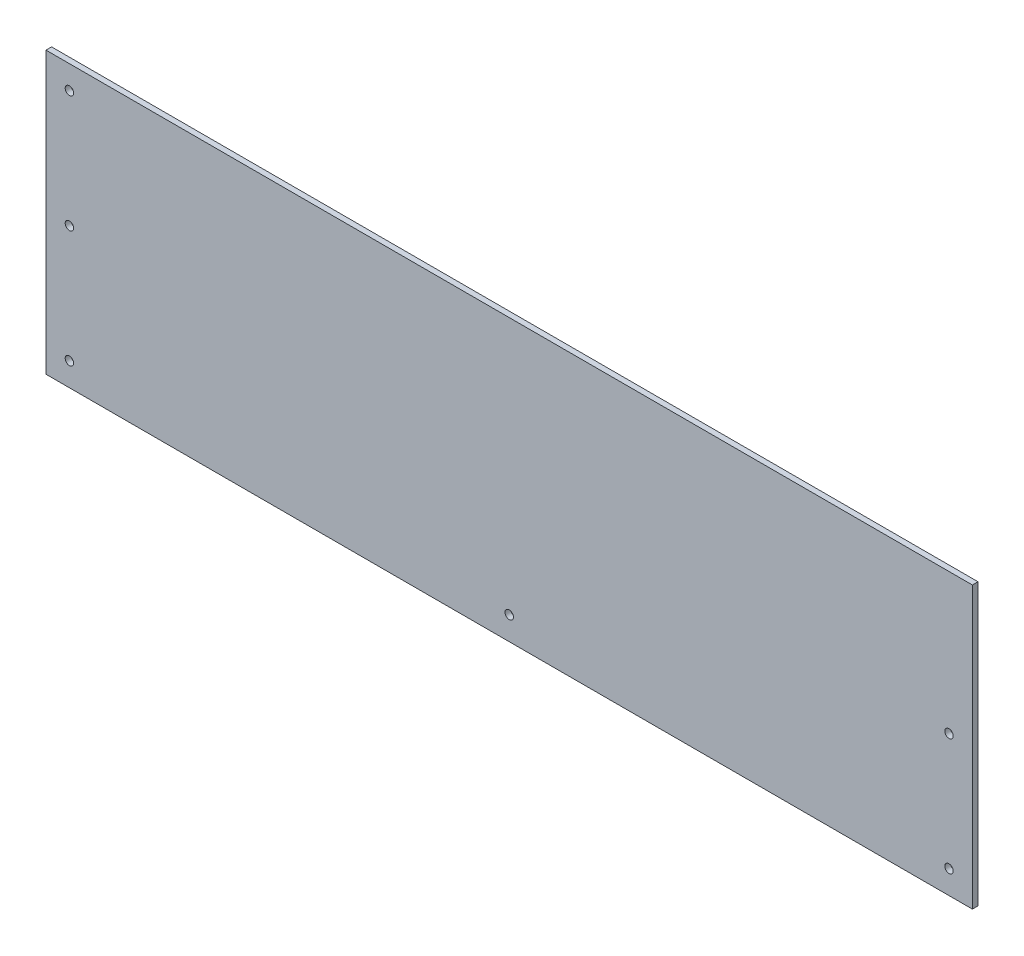
ISO-10303-21;
HEADER;
FILE_DESCRIPTION(('STEP AP214'),'2;1');
FILE_NAME('part.step','',(''),(''),'','','');
FILE_SCHEMA(('AUTOMOTIVE_DESIGN { 1 0 10303 214 1 1 1 1 }'));
ENDSEC;
DATA;
#1=APPLICATION_CONTEXT('core data for automotive mechanical design processes');
#2=APPLICATION_PROTOCOL_DEFINITION('international standard','automotive_design',2000,#1);
#3=PRODUCT_CONTEXT('',#1,'mechanical');
#4=PRODUCT('Part','Part','',(#3));
#5=PRODUCT_RELATED_PRODUCT_CATEGORY('part','',(#4));
#6=PRODUCT_DEFINITION_FORMATION('','',#4);
#7=PRODUCT_DEFINITION_CONTEXT('part definition',#1,'design');
#8=PRODUCT_DEFINITION('design','',#6,#7);
#9=PRODUCT_DEFINITION_SHAPE('','',#8);
#10=(LENGTH_UNIT() NAMED_UNIT(*) SI_UNIT(.MILLI.,.METRE.));
#11=(NAMED_UNIT(*) PLANE_ANGLE_UNIT() SI_UNIT($,.RADIAN.));
#12=(NAMED_UNIT(*) SI_UNIT($,.STERADIAN.) SOLID_ANGLE_UNIT());
#13=UNCERTAINTY_MEASURE_WITH_UNIT(LENGTH_MEASURE(1.E-05),#10,'distance_accuracy_value','');
#14=(GEOMETRIC_REPRESENTATION_CONTEXT(3) GLOBAL_UNCERTAINTY_ASSIGNED_CONTEXT((#13)) GLOBAL_UNIT_ASSIGNED_CONTEXT((#10,
#11,#12)) REPRESENTATION_CONTEXT('',''));
#15=CARTESIAN_POINT('',(0.,0.,0.));
#16=DIRECTION('',(0.,0.,1.));
#17=DIRECTION('',(1.,0.,0.));
#18=AXIS2_PLACEMENT_3D('',#15,#16,#17);
#19=CARTESIAN_POINT('',(0.,0.,3.));
#20=DIRECTION('',(1.,0.,0.));
#21=DIRECTION('',(0.,0.,-1.));
#22=AXIS2_PLACEMENT_3D('',#19,#20,#21);
#23=PLANE('',#22);
#24=DIRECTION('',(0.,-1.,0.));
#25=VECTOR('',#24,1.);
#26=CARTESIAN_POINT('',(0.,0.,0.));
#27=LINE('',#26,#25);
#28=CARTESIAN_POINT('',(0.,150.,0.));
#29=VERTEX_POINT('',#28);
#30=CARTESIAN_POINT('',(0.,0.,0.));
#31=VERTEX_POINT('',#30);
#32=EDGE_CURVE('E96',#29,#31,#27,.T.);
#33=ORIENTED_EDGE('',*,*,#32,.T.);
#34=DIRECTION('',(0.,0.,-1.));
#35=VECTOR('',#34,1.);
#36=CARTESIAN_POINT('',(0.,0.,3.));
#37=LINE('',#36,#35);
#38=CARTESIAN_POINT('',(0.,0.,3.));
#39=VERTEX_POINT('',#38);
#40=EDGE_CURVE('E11',#39,#31,#37,.T.);
#41=ORIENTED_EDGE('',*,*,#40,.F.);
#42=DIRECTION('',(0.,-1.,0.));
#43=VECTOR('',#42,1.);
#44=CARTESIAN_POINT('',(0.,0.,3.));
#45=LINE('',#44,#43);
#46=CARTESIAN_POINT('',(0.,150.,3.));
#47=VERTEX_POINT('',#46);
#48=EDGE_CURVE('E84',#47,#39,#45,.T.);
#49=ORIENTED_EDGE('',*,*,#48,.F.);
#50=DIRECTION('',(0.,0.,-1.));
#51=VECTOR('',#50,1.);
#52=CARTESIAN_POINT('',(0.,150.,3.));
#53=LINE('',#52,#51);
#54=EDGE_CURVE('E92',#47,#29,#53,.T.);
#55=ORIENTED_EDGE('',*,*,#54,.T.);
#56=EDGE_LOOP('',(#33,#41,#49,#55));
#57=FACE_BOUND('',#56,.T.);
#58=ADVANCED_FACE('F33',(#57),#23,.F.);
#59=CARTESIAN_POINT('',(0.,0.,3.));
#60=DIRECTION('',(0.,1.,0.));
#61=DIRECTION('',(0.,0.,1.));
#62=AXIS2_PLACEMENT_3D('',#59,#60,#61);
#63=PLANE('',#62);
#64=DIRECTION('',(1.,0.,0.));
#65=VECTOR('',#64,1.);
#66=CARTESIAN_POINT('',(0.,0.,0.));
#67=LINE('',#66,#65);
#68=CARTESIAN_POINT('',(495.000000000037,0.,0.));
#69=VERTEX_POINT('',#68);
#70=EDGE_CURVE('E88',#31,#69,#67,.T.);
#71=ORIENTED_EDGE('',*,*,#70,.T.);
#72=DIRECTION('',(0.,0.,-1.));
#73=VECTOR('',#72,1.);
#74=CARTESIAN_POINT('',(495.000000000037,0.,3.));
#75=LINE('',#74,#73);
#76=CARTESIAN_POINT('',(495.000000000037,0.,3.));
#77=VERTEX_POINT('',#76);
#78=EDGE_CURVE('E41',#77,#69,#75,.T.);
#79=ORIENTED_EDGE('',*,*,#78,.F.);
#80=DIRECTION('',(1.,0.,0.));
#81=VECTOR('',#80,1.);
#82=CARTESIAN_POINT('',(0.,0.,3.));
#83=LINE('',#82,#81);
#84=EDGE_CURVE('E79',#39,#77,#83,.T.);
#85=ORIENTED_EDGE('',*,*,#84,.F.);
#86=ORIENTED_EDGE('',*,*,#40,.T.);
#87=EDGE_LOOP('',(#71,#79,#85,#86));
#88=FACE_BOUND('',#87,.T.);
#89=ADVANCED_FACE('F87',(#88),#63,.F.);
#90=CARTESIAN_POINT('',(495.000000000037,0.,3.));
#91=DIRECTION('',(-1.,0.,0.));
#92=DIRECTION('',(0.,-1.,0.));
#93=AXIS2_PLACEMENT_3D('',#90,#91,#92);
#94=PLANE('',#93);
#95=DIRECTION('',(0.,1.,0.));
#96=VECTOR('',#95,1.);
#97=CARTESIAN_POINT('',(495.000000000037,0.,0.));
#98=LINE('',#97,#96);
#99=CARTESIAN_POINT('',(495.000000000036,150.,0.));
#100=VERTEX_POINT('',#99);
#101=EDGE_CURVE('E66',#69,#100,#98,.T.);
#102=ORIENTED_EDGE('',*,*,#101,.T.);
#103=DIRECTION('',(0.,0.,-1.));
#104=VECTOR('',#103,1.);
#105=CARTESIAN_POINT('',(495.000000000036,150.,3.));
#106=LINE('',#105,#104);
#107=CARTESIAN_POINT('',(495.000000000036,150.,3.));
#108=VERTEX_POINT('',#107);
#109=EDGE_CURVE('E89',#108,#100,#106,.T.);
#110=ORIENTED_EDGE('',*,*,#109,.F.);
#111=DIRECTION('',(0.,1.,0.));
#112=VECTOR('',#111,1.);
#113=CARTESIAN_POINT('',(495.000000000037,0.,3.));
#114=LINE('',#113,#112);
#115=EDGE_CURVE('E82',#77,#108,#114,.T.);
#116=ORIENTED_EDGE('',*,*,#115,.F.);
#117=ORIENTED_EDGE('',*,*,#78,.T.);
#118=EDGE_LOOP('',(#102,#110,#116,#117));
#119=FACE_BOUND('',#118,.T.);
#120=ADVANCED_FACE('F90',(#119),#94,.F.);
#121=CARTESIAN_POINT('',(0.,150.,3.));
#122=DIRECTION('',(0.,-1.,0.));
#123=DIRECTION('',(0.,0.,-1.));
#124=AXIS2_PLACEMENT_3D('',#121,#122,#123);
#125=PLANE('',#124);
#126=DIRECTION('',(-1.,0.,0.));
#127=VECTOR('',#126,1.);
#128=CARTESIAN_POINT('',(0.,150.,0.));
#129=LINE('',#128,#127);
#130=EDGE_CURVE('E72',#100,#29,#129,.T.);
#131=ORIENTED_EDGE('',*,*,#130,.T.);
#132=ORIENTED_EDGE('',*,*,#54,.F.);
#133=DIRECTION('',(-1.,0.,0.));
#134=VECTOR('',#133,1.);
#135=CARTESIAN_POINT('',(0.,150.,3.));
#136=LINE('',#135,#134);
#137=EDGE_CURVE('E49',#108,#47,#136,.T.);
#138=ORIENTED_EDGE('',*,*,#137,.F.);
#139=ORIENTED_EDGE('',*,*,#109,.T.);
#140=EDGE_LOOP('',(#131,#132,#138,#139));
#141=FACE_BOUND('',#140,.T.);
#142=ADVANCED_FACE('F104',(#141),#125,.F.);
#143=CARTESIAN_POINT('',(0.,0.,3.));
#144=DIRECTION('',(0.,0.,-1.));
#145=DIRECTION('',(-1.,0.,0.));
#146=AXIS2_PLACEMENT_3D('',#143,#144,#145);
#147=PLANE('',#146);
#148=CARTESIAN_POINT('',(12.5,75.,3.));
#149=DIRECTION('',(0.,0.,1.));
#150=DIRECTION('',(1.,0.,0.));
#151=AXIS2_PLACEMENT_3D('',#148,#149,#150);
#152=CIRCLE('',#151,2.25);
#153=CARTESIAN_POINT('',(14.75,75.,3.));
#154=VERTEX_POINT('',#153);
#155=EDGE_CURVE('E142',#154,#154,#152,.T.);
#156=ORIENTED_EDGE('',*,*,#155,.F.);
#157=EDGE_LOOP('',(#156));
#158=FACE_BOUND('',#157,.T.);
#159=CARTESIAN_POINT('',(12.5,137.5,3.));
#160=DIRECTION('',(0.,0.,1.));
#161=DIRECTION('',(1.,0.,0.));
#162=AXIS2_PLACEMENT_3D('',#159,#160,#161);
#163=CIRCLE('',#162,2.25);
#164=CARTESIAN_POINT('',(14.75,137.5,3.));
#165=VERTEX_POINT('',#164);
#166=EDGE_CURVE('E136',#165,#165,#163,.T.);
#167=ORIENTED_EDGE('',*,*,#166,.F.);
#168=EDGE_LOOP('',(#167));
#169=FACE_BOUND('',#168,.T.);
#170=CARTESIAN_POINT('',(12.5,12.5,3.));
#171=DIRECTION('',(0.,0.,1.));
#172=DIRECTION('',(1.,0.,0.));
#173=AXIS2_PLACEMENT_3D('',#170,#171,#172);
#174=CIRCLE('',#173,2.25);
#175=CARTESIAN_POINT('',(14.75,12.5,3.));
#176=VERTEX_POINT('',#175);
#177=EDGE_CURVE('E130',#176,#176,#174,.T.);
#178=ORIENTED_EDGE('',*,*,#177,.F.);
#179=EDGE_LOOP('',(#178));
#180=FACE_BOUND('',#179,.T.);
#181=CARTESIAN_POINT('',(247.500000000018,12.5,3.));
#182=DIRECTION('',(0.,0.,1.));
#183=DIRECTION('',(1.,0.,0.));
#184=AXIS2_PLACEMENT_3D('',#181,#182,#183);
#185=CIRCLE('',#184,2.25);
#186=CARTESIAN_POINT('',(249.750000000018,12.5,3.));
#187=VERTEX_POINT('',#186);
#188=EDGE_CURVE('E124',#187,#187,#185,.T.);
#189=ORIENTED_EDGE('',*,*,#188,.F.);
#190=EDGE_LOOP('',(#189));
#191=FACE_BOUND('',#190,.T.);
#192=CARTESIAN_POINT('',(482.500000000037,12.5,3.));
#193=DIRECTION('',(0.,0.,1.));
#194=DIRECTION('',(1.,0.,0.));
#195=AXIS2_PLACEMENT_3D('',#192,#193,#194);
#196=CIRCLE('',#195,2.24999999999997);
#197=CARTESIAN_POINT('',(484.750000000037,12.5,3.));
#198=VERTEX_POINT('',#197);
#199=EDGE_CURVE('E118',#198,#198,#196,.T.);
#200=ORIENTED_EDGE('',*,*,#199,.F.);
#201=EDGE_LOOP('',(#200));
#202=FACE_BOUND('',#201,.T.);
#203=CARTESIAN_POINT('',(482.500000000037,75.,3.));
#204=DIRECTION('',(0.,0.,1.));
#205=DIRECTION('',(1.,0.,0.));
#206=AXIS2_PLACEMENT_3D('',#203,#204,#205);
#207=CIRCLE('',#206,2.24999999999997);
#208=CARTESIAN_POINT('',(484.750000000037,75.,3.));
#209=VERTEX_POINT('',#208);
#210=EDGE_CURVE('E112',#209,#209,#207,.T.);
#211=ORIENTED_EDGE('',*,*,#210,.F.);
#212=EDGE_LOOP('',(#211));
#213=FACE_BOUND('',#212,.T.);
#214=ORIENTED_EDGE('',*,*,#48,.T.);
#215=ORIENTED_EDGE('',*,*,#84,.T.);
#216=ORIENTED_EDGE('',*,*,#115,.T.);
#217=ORIENTED_EDGE('',*,*,#137,.T.);
#218=EDGE_LOOP('',(#214,#215,#216,#217));
#219=FACE_BOUND('',#218,.T.);
#220=ADVANCED_FACE('F80',(#158,#169,#180,#191,#202,#213,#219),#147,.F.);
#221=CARTESIAN_POINT('',(0.,0.,0.));
#222=DIRECTION('',(0.,0.,-1.));
#223=DIRECTION('',(-1.,0.,0.));
#224=AXIS2_PLACEMENT_3D('',#221,#222,#223);
#225=PLANE('',#224);
#226=CARTESIAN_POINT('',(12.5,75.,0.));
#227=DIRECTION('',(0.,0.,1.));
#228=DIRECTION('',(1.,0.,0.));
#229=AXIS2_PLACEMENT_3D('',#226,#227,#228);
#230=CIRCLE('',#229,2.25);
#231=CARTESIAN_POINT('',(14.75,75.,0.));
#232=VERTEX_POINT('',#231);
#233=EDGE_CURVE('E139',#232,#232,#230,.T.);
#234=ORIENTED_EDGE('',*,*,#233,.T.);
#235=EDGE_LOOP('',(#234));
#236=FACE_BOUND('',#235,.T.);
#237=CARTESIAN_POINT('',(12.5,137.5,0.));
#238=DIRECTION('',(0.,0.,1.));
#239=DIRECTION('',(1.,0.,0.));
#240=AXIS2_PLACEMENT_3D('',#237,#238,#239);
#241=CIRCLE('',#240,2.25);
#242=CARTESIAN_POINT('',(14.75,137.5,0.));
#243=VERTEX_POINT('',#242);
#244=EDGE_CURVE('E133',#243,#243,#241,.T.);
#245=ORIENTED_EDGE('',*,*,#244,.T.);
#246=EDGE_LOOP('',(#245));
#247=FACE_BOUND('',#246,.T.);
#248=CARTESIAN_POINT('',(12.5,12.5,0.));
#249=DIRECTION('',(0.,0.,1.));
#250=DIRECTION('',(1.,0.,0.));
#251=AXIS2_PLACEMENT_3D('',#248,#249,#250);
#252=CIRCLE('',#251,2.25);
#253=CARTESIAN_POINT('',(14.75,12.5,0.));
#254=VERTEX_POINT('',#253);
#255=EDGE_CURVE('E127',#254,#254,#252,.T.);
#256=ORIENTED_EDGE('',*,*,#255,.T.);
#257=EDGE_LOOP('',(#256));
#258=FACE_BOUND('',#257,.T.);
#259=CARTESIAN_POINT('',(247.500000000018,12.5,0.));
#260=DIRECTION('',(0.,0.,1.));
#261=DIRECTION('',(1.,0.,0.));
#262=AXIS2_PLACEMENT_3D('',#259,#260,#261);
#263=CIRCLE('',#262,2.25);
#264=CARTESIAN_POINT('',(249.750000000018,12.5,0.));
#265=VERTEX_POINT('',#264);
#266=EDGE_CURVE('E121',#265,#265,#263,.T.);
#267=ORIENTED_EDGE('',*,*,#266,.T.);
#268=EDGE_LOOP('',(#267));
#269=FACE_BOUND('',#268,.T.);
#270=CARTESIAN_POINT('',(482.500000000037,12.5,0.));
#271=DIRECTION('',(0.,0.,1.));
#272=DIRECTION('',(1.,0.,0.));
#273=AXIS2_PLACEMENT_3D('',#270,#271,#272);
#274=CIRCLE('',#273,2.24999999999997);
#275=CARTESIAN_POINT('',(484.750000000037,12.5,0.));
#276=VERTEX_POINT('',#275);
#277=EDGE_CURVE('E115',#276,#276,#274,.T.);
#278=ORIENTED_EDGE('',*,*,#277,.T.);
#279=EDGE_LOOP('',(#278));
#280=FACE_BOUND('',#279,.T.);
#281=CARTESIAN_POINT('',(482.500000000037,75.,0.));
#282=DIRECTION('',(0.,0.,1.));
#283=DIRECTION('',(1.,0.,0.));
#284=AXIS2_PLACEMENT_3D('',#281,#282,#283);
#285=CIRCLE('',#284,2.24999999999997);
#286=CARTESIAN_POINT('',(484.750000000037,75.,0.));
#287=VERTEX_POINT('',#286);
#288=EDGE_CURVE('E99',#287,#287,#285,.T.);
#289=ORIENTED_EDGE('',*,*,#288,.T.);
#290=EDGE_LOOP('',(#289));
#291=FACE_BOUND('',#290,.T.);
#292=ORIENTED_EDGE('',*,*,#32,.F.);
#293=ORIENTED_EDGE('',*,*,#130,.F.);
#294=ORIENTED_EDGE('',*,*,#101,.F.);
#295=ORIENTED_EDGE('',*,*,#70,.F.);
#296=EDGE_LOOP('',(#292,#293,#294,#295));
#297=FACE_BOUND('',#296,.T.);
#298=ADVANCED_FACE('F107',(#236,#247,#258,#269,#280,#291,#297),#225,.T.);
#299=CARTESIAN_POINT('',(482.500000000037,75.,3.));
#300=DIRECTION('',(0.,0.,1.));
#301=DIRECTION('',(1.,0.,0.));
#302=AXIS2_PLACEMENT_3D('',#299,#300,#301);
#303=CYLINDRICAL_SURFACE('',#302,2.24999999999997);
#304=ORIENTED_EDGE('',*,*,#288,.F.);
#305=EDGE_LOOP('',(#304));
#306=FACE_BOUND('',#305,.T.);
#307=ORIENTED_EDGE('',*,*,#210,.T.);
#308=EDGE_LOOP('',(#307));
#309=FACE_BOUND('',#308,.T.);
#310=ADVANCED_FACE('F161',(#306,#309),#303,.F.);
#311=CARTESIAN_POINT('',(482.500000000037,12.5,3.));
#312=DIRECTION('',(0.,0.,1.));
#313=DIRECTION('',(1.,0.,0.));
#314=AXIS2_PLACEMENT_3D('',#311,#312,#313);
#315=CYLINDRICAL_SURFACE('',#314,2.24999999999997);
#316=ORIENTED_EDGE('',*,*,#277,.F.);
#317=EDGE_LOOP('',(#316));
#318=FACE_BOUND('',#317,.T.);
#319=ORIENTED_EDGE('',*,*,#199,.T.);
#320=EDGE_LOOP('',(#319));
#321=FACE_BOUND('',#320,.T.);
#322=ADVANCED_FACE('F163',(#318,#321),#315,.F.);
#323=CARTESIAN_POINT('',(247.500000000018,12.5,3.));
#324=DIRECTION('',(0.,0.,1.));
#325=DIRECTION('',(1.,0.,0.));
#326=AXIS2_PLACEMENT_3D('',#323,#324,#325);
#327=CYLINDRICAL_SURFACE('',#326,2.25);
#328=ORIENTED_EDGE('',*,*,#266,.F.);
#329=EDGE_LOOP('',(#328));
#330=FACE_BOUND('',#329,.T.);
#331=ORIENTED_EDGE('',*,*,#188,.T.);
#332=EDGE_LOOP('',(#331));
#333=FACE_BOUND('',#332,.T.);
#334=ADVANCED_FACE('F170',(#330,#333),#327,.F.);
#335=CARTESIAN_POINT('',(12.5,12.5,3.));
#336=DIRECTION('',(0.,0.,1.));
#337=DIRECTION('',(1.,0.,0.));
#338=AXIS2_PLACEMENT_3D('',#335,#336,#337);
#339=CYLINDRICAL_SURFACE('',#338,2.25);
#340=ORIENTED_EDGE('',*,*,#255,.F.);
#341=EDGE_LOOP('',(#340));
#342=FACE_BOUND('',#341,.T.);
#343=ORIENTED_EDGE('',*,*,#177,.T.);
#344=EDGE_LOOP('',(#343));
#345=FACE_BOUND('',#344,.T.);
#346=ADVANCED_FACE('F217',(#342,#345),#339,.F.);
#347=CARTESIAN_POINT('',(12.5,137.5,3.));
#348=DIRECTION('',(0.,0.,1.));
#349=DIRECTION('',(1.,0.,0.));
#350=AXIS2_PLACEMENT_3D('',#347,#348,#349);
#351=CYLINDRICAL_SURFACE('',#350,2.25);
#352=ORIENTED_EDGE('',*,*,#244,.F.);
#353=EDGE_LOOP('',(#352));
#354=FACE_BOUND('',#353,.T.);
#355=ORIENTED_EDGE('',*,*,#166,.T.);
#356=EDGE_LOOP('',(#355));
#357=FACE_BOUND('',#356,.T.);
#358=ADVANCED_FACE('F227',(#354,#357),#351,.F.);
#359=CARTESIAN_POINT('',(12.5,75.,3.));
#360=DIRECTION('',(0.,0.,1.));
#361=DIRECTION('',(1.,0.,0.));
#362=AXIS2_PLACEMENT_3D('',#359,#360,#361);
#363=CYLINDRICAL_SURFACE('',#362,2.25);
#364=ORIENTED_EDGE('',*,*,#233,.F.);
#365=EDGE_LOOP('',(#364));
#366=FACE_BOUND('',#365,.T.);
#367=ORIENTED_EDGE('',*,*,#155,.T.);
#368=EDGE_LOOP('',(#367));
#369=FACE_BOUND('',#368,.T.);
#370=ADVANCED_FACE('F146',(#366,#369),#363,.F.);
#371=CLOSED_SHELL('',(#58,#89,#120,#142,#220,#298,#310,#322,#334,#346,#358,#370));
#372=MANIFOLD_SOLID_BREP('B2',#371);
#373=ADVANCED_BREP_SHAPE_REPRESENTATION('',(#18,#372),#14);
#374=SHAPE_DEFINITION_REPRESENTATION(#9,#373);
ENDSEC;
END-ISO-10303-21;
